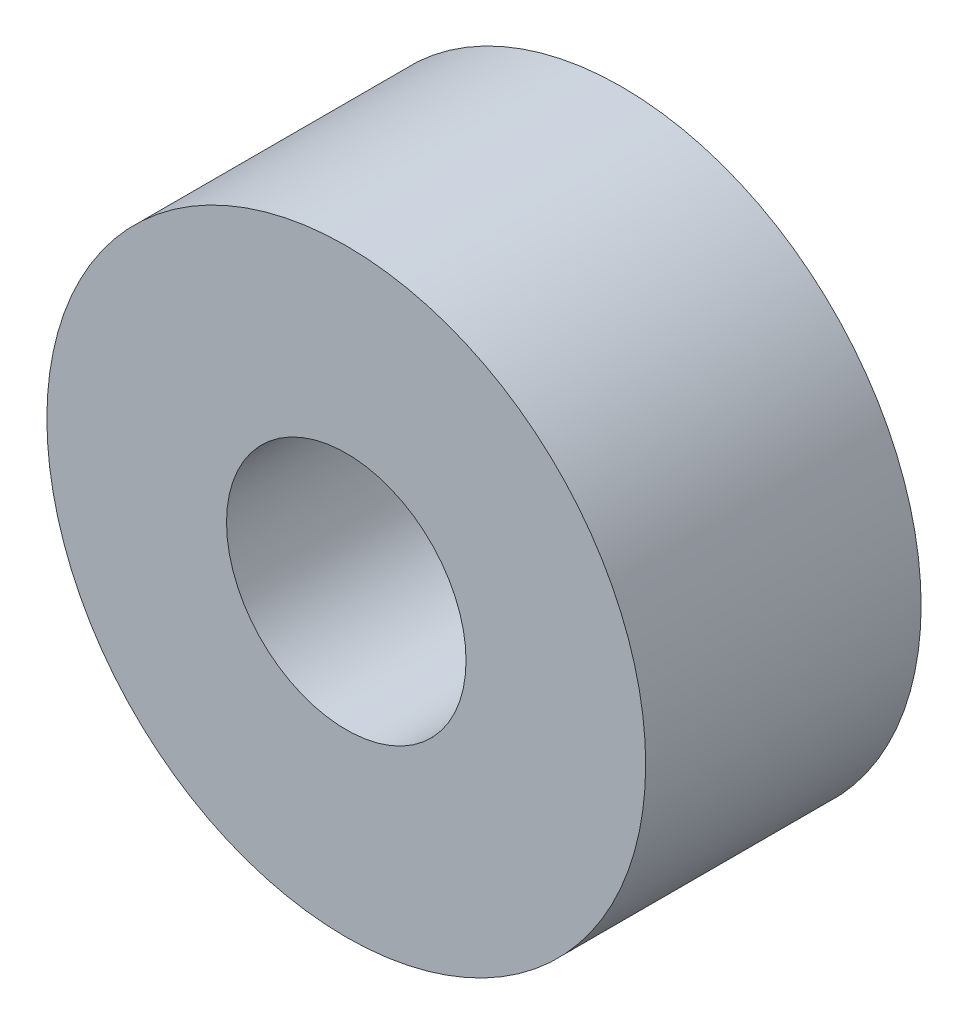
ISO-10303-21;
HEADER;
FILE_DESCRIPTION(('STEP AP214'),'2;1');
FILE_NAME('part.step','',(''),(''),'','','');
FILE_SCHEMA(('AUTOMOTIVE_DESIGN { 1 0 10303 214 1 1 1 1 }'));
ENDSEC;
DATA;
#1=APPLICATION_CONTEXT('core data for automotive mechanical design processes');
#2=APPLICATION_PROTOCOL_DEFINITION('international standard','automotive_design',2000,#1);
#3=PRODUCT_CONTEXT('',#1,'mechanical');
#4=PRODUCT('Part','Part','',(#3));
#5=PRODUCT_RELATED_PRODUCT_CATEGORY('part','',(#4));
#6=PRODUCT_DEFINITION_FORMATION('','',#4);
#7=PRODUCT_DEFINITION_CONTEXT('part definition',#1,'design');
#8=PRODUCT_DEFINITION('design','',#6,#7);
#9=PRODUCT_DEFINITION_SHAPE('','',#8);
#10=(LENGTH_UNIT() NAMED_UNIT(*) SI_UNIT(.MILLI.,.METRE.));
#11=(NAMED_UNIT(*) PLANE_ANGLE_UNIT() SI_UNIT($,.RADIAN.));
#12=(NAMED_UNIT(*) SI_UNIT($,.STERADIAN.) SOLID_ANGLE_UNIT());
#13=UNCERTAINTY_MEASURE_WITH_UNIT(LENGTH_MEASURE(1.E-05),#10,'distance_accuracy_value','');
#14=(GEOMETRIC_REPRESENTATION_CONTEXT(3) GLOBAL_UNCERTAINTY_ASSIGNED_CONTEXT((#13)) GLOBAL_UNIT_ASSIGNED_CONTEXT((#10,
#11,#12)) REPRESENTATION_CONTEXT('',''));
#15=CARTESIAN_POINT('',(0.,0.,0.));
#16=DIRECTION('',(0.,0.,1.));
#17=DIRECTION('',(1.,0.,0.));
#18=AXIS2_PLACEMENT_3D('',#15,#16,#17);
#19=CARTESIAN_POINT('',(0.,0.,2.3));
#20=DIRECTION('',(0.,0.,1.));
#21=DIRECTION('',(1.,0.,0.));
#22=AXIS2_PLACEMENT_3D('',#19,#20,#21);
#23=PLANE('',#22);
#24=CARTESIAN_POINT('',(0.,0.,2.3));
#25=DIRECTION('',(0.,0.,1.));
#26=DIRECTION('',(1.,0.,0.));
#27=AXIS2_PLACEMENT_3D('',#24,#25,#26);
#28=CIRCLE('',#27,2.5);
#29=CARTESIAN_POINT('',(2.5,0.,2.3));
#30=VERTEX_POINT('',#29);
#31=EDGE_CURVE('E10',#30,#30,#28,.T.);
#32=ORIENTED_EDGE('',*,*,#31,.T.);
#33=EDGE_LOOP('',(#32));
#34=FACE_BOUND('',#33,.T.);
#35=CARTESIAN_POINT('',(0.,0.,2.3));
#36=DIRECTION('',(0.,0.,1.));
#37=DIRECTION('',(1.,0.,0.));
#38=AXIS2_PLACEMENT_3D('',#35,#36,#37);
#39=CIRCLE('',#38,1.);
#40=CARTESIAN_POINT('',(1.,0.,2.3));
#41=VERTEX_POINT('',#40);
#42=EDGE_CURVE('E50',#41,#41,#39,.T.);
#43=ORIENTED_EDGE('',*,*,#42,.F.);
#44=EDGE_LOOP('',(#43));
#45=FACE_BOUND('',#44,.T.);
#46=ADVANCED_FACE('F37',(#34,#45),#23,.T.);
#47=CARTESIAN_POINT('',(0.,0.,0.));
#48=DIRECTION('',(0.,0.,1.));
#49=DIRECTION('',(1.,0.,0.));
#50=AXIS2_PLACEMENT_3D('',#47,#48,#49);
#51=PLANE('',#50);
#52=CARTESIAN_POINT('',(0.,0.,0.));
#53=DIRECTION('',(0.,0.,1.));
#54=DIRECTION('',(1.,0.,0.));
#55=AXIS2_PLACEMENT_3D('',#52,#53,#54);
#56=CIRCLE('',#55,2.5);
#57=CARTESIAN_POINT('',(2.5,0.,0.));
#58=VERTEX_POINT('',#57);
#59=EDGE_CURVE('E41',#58,#58,#56,.T.);
#60=ORIENTED_EDGE('',*,*,#59,.F.);
#61=EDGE_LOOP('',(#60));
#62=FACE_BOUND('',#61,.T.);
#63=CARTESIAN_POINT('',(0.,0.,0.));
#64=DIRECTION('',(0.,0.,1.));
#65=DIRECTION('',(1.,0.,0.));
#66=AXIS2_PLACEMENT_3D('',#63,#64,#65);
#67=CIRCLE('',#66,1.);
#68=CARTESIAN_POINT('',(1.,0.,0.));
#69=VERTEX_POINT('',#68);
#70=EDGE_CURVE('E52',#69,#69,#67,.T.);
#71=ORIENTED_EDGE('',*,*,#70,.T.);
#72=EDGE_LOOP('',(#71));
#73=FACE_BOUND('',#72,.T.);
#74=ADVANCED_FACE('F64',(#62,#73),#51,.F.);
#75=CARTESIAN_POINT('',(0.,0.,2.3));
#76=DIRECTION('',(0.,0.,-1.));
#77=DIRECTION('',(-1.,0.,0.));
#78=AXIS2_PLACEMENT_3D('',#75,#76,#77);
#79=CYLINDRICAL_SURFACE('',#78,2.5);
#80=ORIENTED_EDGE('',*,*,#31,.F.);
#81=EDGE_LOOP('',(#80));
#82=FACE_BOUND('',#81,.T.);
#83=ORIENTED_EDGE('',*,*,#59,.T.);
#84=EDGE_LOOP('',(#83));
#85=FACE_BOUND('',#84,.T.);
#86=ADVANCED_FACE('F39',(#82,#85),#79,.T.);
#87=CARTESIAN_POINT('',(0.,0.,2.3));
#88=DIRECTION('',(0.,0.,-1.));
#89=DIRECTION('',(-1.,0.,0.));
#90=AXIS2_PLACEMENT_3D('',#87,#88,#89);
#91=CYLINDRICAL_SURFACE('',#90,1.);
#92=ORIENTED_EDGE('',*,*,#42,.T.);
#93=EDGE_LOOP('',(#92));
#94=FACE_BOUND('',#93,.T.);
#95=ORIENTED_EDGE('',*,*,#70,.F.);
#96=EDGE_LOOP('',(#95));
#97=FACE_BOUND('',#96,.T.);
#98=ADVANCED_FACE('F60',(#94,#97),#91,.F.);
#99=CLOSED_SHELL('',(#46,#74,#86,#98));
#100=MANIFOLD_SOLID_BREP('B2',#99);
#101=ADVANCED_BREP_SHAPE_REPRESENTATION('',(#18,#100),#14);
#102=SHAPE_DEFINITION_REPRESENTATION(#9,#101);
ENDSEC;
END-ISO-10303-21;
